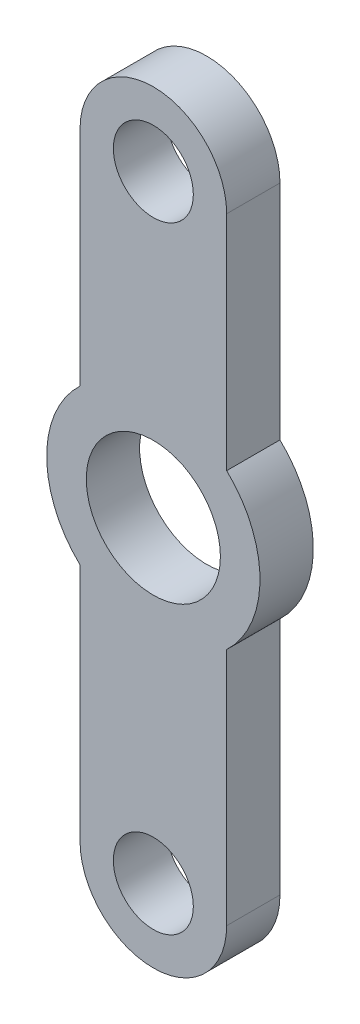
ISO-10303-21;
HEADER;
FILE_DESCRIPTION(('STEP AP214'),'2;1');
FILE_NAME('part.step','',(''),(''),'','','');
FILE_SCHEMA(('AUTOMOTIVE_DESIGN { 1 0 10303 214 1 1 1 1 }'));
ENDSEC;
DATA;
#1=APPLICATION_CONTEXT('core data for automotive mechanical design processes');
#2=APPLICATION_PROTOCOL_DEFINITION('international standard','automotive_design',2000,#1);
#3=PRODUCT_CONTEXT('',#1,'mechanical');
#4=PRODUCT('Part','Part','',(#3));
#5=PRODUCT_RELATED_PRODUCT_CATEGORY('part','',(#4));
#6=PRODUCT_DEFINITION_FORMATION('','',#4);
#7=PRODUCT_DEFINITION_CONTEXT('part definition',#1,'design');
#8=PRODUCT_DEFINITION('design','',#6,#7);
#9=PRODUCT_DEFINITION_SHAPE('','',#8);
#10=(LENGTH_UNIT() NAMED_UNIT(*) SI_UNIT(.MILLI.,.METRE.));
#11=(NAMED_UNIT(*) PLANE_ANGLE_UNIT() SI_UNIT($,.RADIAN.));
#12=(NAMED_UNIT(*) SI_UNIT($,.STERADIAN.) SOLID_ANGLE_UNIT());
#13=UNCERTAINTY_MEASURE_WITH_UNIT(LENGTH_MEASURE(1.E-05),#10,'distance_accuracy_value','');
#14=(GEOMETRIC_REPRESENTATION_CONTEXT(3) GLOBAL_UNCERTAINTY_ASSIGNED_CONTEXT((#13)) GLOBAL_UNIT_ASSIGNED_CONTEXT((#10,
#11,#12)) REPRESENTATION_CONTEXT('',''));
#15=CARTESIAN_POINT('',(0.,0.,0.));
#16=DIRECTION('',(0.,0.,1.));
#17=DIRECTION('',(1.,0.,0.));
#18=AXIS2_PLACEMENT_3D('',#15,#16,#17);
#19=CARTESIAN_POINT('',(0.,22.5,4.));
#20=DIRECTION('',(0.,0.,-1.));
#21=DIRECTION('',(-1.,0.,0.));
#22=AXIS2_PLACEMENT_3D('',#19,#20,#21);
#23=PLANE('',#22);
#24=CARTESIAN_POINT('',(0.,22.5,4.));
#25=DIRECTION('',(0.,0.,1.));
#26=DIRECTION('',(-1.,0.,0.));
#27=AXIS2_PLACEMENT_3D('',#24,#25,#26);
#28=CIRCLE('',#27,5.5);
#29=CARTESIAN_POINT('',(5.5,22.5,4.));
#30=VERTEX_POINT('',#29);
#31=CARTESIAN_POINT('',(-5.5,22.5,4.));
#32=VERTEX_POINT('',#31);
#33=EDGE_CURVE('E164',#30,#32,#28,.T.);
#34=ORIENTED_EDGE('',*,*,#33,.T.);
#35=DIRECTION('',(0.,-1.,0.));
#36=VECTOR('',#35,1.);
#37=CARTESIAN_POINT('',(-5.5,22.5,4.));
#38=LINE('',#37,#36);
#39=CARTESIAN_POINT('',(-5.5,5.80947501931113,4.));
#40=VERTEX_POINT('',#39);
#41=EDGE_CURVE('E100',#32,#40,#38,.T.);
#42=ORIENTED_EDGE('',*,*,#41,.T.);
#43=CARTESIAN_POINT('',(0.,0.,4.));
#44=DIRECTION('',(0.,0.,1.));
#45=DIRECTION('',(-1.,0.,0.));
#46=AXIS2_PLACEMENT_3D('',#43,#44,#45);
#47=CIRCLE('',#46,8.00000000000001);
#48=CARTESIAN_POINT('',(-5.5,-5.80947501931112,4.));
#49=VERTEX_POINT('',#48);
#50=EDGE_CURVE('E185',#40,#49,#47,.T.);
#51=ORIENTED_EDGE('',*,*,#50,.T.);
#52=DIRECTION('',(0.,-1.,0.));
#53=VECTOR('',#52,1.);
#54=CARTESIAN_POINT('',(-5.5,-23.75,4.));
#55=LINE('',#54,#53);
#56=CARTESIAN_POINT('',(-5.5,-23.75,4.));
#57=VERTEX_POINT('',#56);
#58=EDGE_CURVE('E199',#49,#57,#55,.T.);
#59=ORIENTED_EDGE('',*,*,#58,.T.);
#60=CARTESIAN_POINT('',(0.,-23.75,4.));
#61=DIRECTION('',(0.,0.,1.));
#62=DIRECTION('',(1.,0.,0.));
#63=AXIS2_PLACEMENT_3D('',#60,#61,#62);
#64=CIRCLE('',#63,5.5);
#65=CARTESIAN_POINT('',(5.5,-23.75,4.));
#66=VERTEX_POINT('',#65);
#67=EDGE_CURVE('E119',#57,#66,#64,.T.);
#68=ORIENTED_EDGE('',*,*,#67,.T.);
#69=DIRECTION('',(0.,1.,0.));
#70=VECTOR('',#69,1.);
#71=CARTESIAN_POINT('',(5.5,-23.75,4.));
#72=LINE('',#71,#70);
#73=CARTESIAN_POINT('',(5.5,-5.80947501931113,4.));
#74=VERTEX_POINT('',#73);
#75=EDGE_CURVE('E113',#66,#74,#72,.T.);
#76=ORIENTED_EDGE('',*,*,#75,.T.);
#77=CARTESIAN_POINT('',(0.,0.,4.));
#78=DIRECTION('',(0.,0.,1.));
#79=DIRECTION('',(-1.,0.,0.));
#80=AXIS2_PLACEMENT_3D('',#77,#78,#79);
#81=CIRCLE('',#80,8.);
#82=CARTESIAN_POINT('',(5.5,5.80947501931112,4.));
#83=VERTEX_POINT('',#82);
#84=EDGE_CURVE('E117',#74,#83,#81,.T.);
#85=ORIENTED_EDGE('',*,*,#84,.T.);
#86=DIRECTION('',(0.,1.,0.));
#87=VECTOR('',#86,1.);
#88=CARTESIAN_POINT('',(5.5,22.5,4.));
#89=LINE('',#88,#87);
#90=EDGE_CURVE('E57',#83,#30,#89,.T.);
#91=ORIENTED_EDGE('',*,*,#90,.T.);
#92=EDGE_LOOP('',(#34,#42,#51,#59,#68,#76,#85,#91));
#93=FACE_BOUND('',#92,.T.);
#94=CARTESIAN_POINT('',(0.,22.5,4.));
#95=DIRECTION('',(0.,0.,1.));
#96=DIRECTION('',(1.,0.,0.));
#97=AXIS2_PLACEMENT_3D('',#94,#95,#96);
#98=CIRCLE('',#97,3.);
#99=CARTESIAN_POINT('',(3.,22.5,4.));
#100=VERTEX_POINT('',#99);
#101=EDGE_CURVE('E146',#100,#100,#98,.T.);
#102=ORIENTED_EDGE('',*,*,#101,.F.);
#103=EDGE_LOOP('',(#102));
#104=FACE_BOUND('',#103,.T.);
#105=CARTESIAN_POINT('',(0.,-23.75,4.));
#106=DIRECTION('',(0.,0.,1.));
#107=DIRECTION('',(1.,0.,0.));
#108=AXIS2_PLACEMENT_3D('',#105,#106,#107);
#109=CIRCLE('',#108,3.);
#110=CARTESIAN_POINT('',(3.,-23.75,4.));
#111=VERTEX_POINT('',#110);
#112=EDGE_CURVE('E213',#111,#111,#109,.T.);
#113=ORIENTED_EDGE('',*,*,#112,.F.);
#114=EDGE_LOOP('',(#113));
#115=FACE_BOUND('',#114,.T.);
#116=CARTESIAN_POINT('',(0.,0.,4.));
#117=DIRECTION('',(0.,0.,1.));
#118=DIRECTION('',(1.,0.,0.));
#119=AXIS2_PLACEMENT_3D('',#116,#117,#118);
#120=CIRCLE('',#119,5.03);
#121=CARTESIAN_POINT('',(5.03,0.,4.));
#122=VERTEX_POINT('',#121);
#123=EDGE_CURVE('E221',#122,#122,#120,.T.);
#124=ORIENTED_EDGE('',*,*,#123,.F.);
#125=EDGE_LOOP('',(#124));
#126=FACE_BOUND('',#125,.T.);
#127=ADVANCED_FACE('F39',(#93,#104,#115,#126),#23,.F.);
#128=CARTESIAN_POINT('',(0.,22.5,0.));
#129=DIRECTION('',(0.,0.,-1.));
#130=DIRECTION('',(-1.,0.,0.));
#131=AXIS2_PLACEMENT_3D('',#128,#129,#130);
#132=PLANE('',#131);
#133=CARTESIAN_POINT('',(0.,-23.75,0.));
#134=DIRECTION('',(0.,0.,1.));
#135=DIRECTION('',(1.,0.,0.));
#136=AXIS2_PLACEMENT_3D('',#133,#134,#135);
#137=CIRCLE('',#136,3.);
#138=CARTESIAN_POINT('',(3.,-23.75,0.));
#139=VERTEX_POINT('',#138);
#140=EDGE_CURVE('E217',#139,#139,#137,.T.);
#141=ORIENTED_EDGE('',*,*,#140,.T.);
#142=EDGE_LOOP('',(#141));
#143=FACE_BOUND('',#142,.T.);
#144=CARTESIAN_POINT('',(0.,22.5,0.));
#145=DIRECTION('',(0.,0.,1.));
#146=DIRECTION('',(-1.,0.,0.));
#147=AXIS2_PLACEMENT_3D('',#144,#145,#146);
#148=CIRCLE('',#147,5.5);
#149=CARTESIAN_POINT('',(5.5,22.5,0.));
#150=VERTEX_POINT('',#149);
#151=CARTESIAN_POINT('',(-5.5,22.5,0.));
#152=VERTEX_POINT('',#151);
#153=EDGE_CURVE('E141',#150,#152,#148,.T.);
#154=ORIENTED_EDGE('',*,*,#153,.F.);
#155=DIRECTION('',(0.,1.,0.));
#156=VECTOR('',#155,1.);
#157=CARTESIAN_POINT('',(5.5,22.5,0.));
#158=LINE('',#157,#156);
#159=CARTESIAN_POINT('',(5.5,5.80947501931112,0.));
#160=VERTEX_POINT('',#159);
#161=EDGE_CURVE('E92',#160,#150,#158,.T.);
#162=ORIENTED_EDGE('',*,*,#161,.F.);
#163=CARTESIAN_POINT('',(0.,0.,0.));
#164=DIRECTION('',(0.,0.,1.));
#165=DIRECTION('',(-1.,0.,0.));
#166=AXIS2_PLACEMENT_3D('',#163,#164,#165);
#167=CIRCLE('',#166,8.);
#168=CARTESIAN_POINT('',(5.5,-5.80947501931113,0.));
#169=VERTEX_POINT('',#168);
#170=EDGE_CURVE('E86',#169,#160,#167,.T.);
#171=ORIENTED_EDGE('',*,*,#170,.F.);
#172=DIRECTION('',(0.,1.,0.));
#173=VECTOR('',#172,1.);
#174=CARTESIAN_POINT('',(5.5,-23.75,0.));
#175=LINE('',#174,#173);
#176=CARTESIAN_POINT('',(5.5,-23.75,0.));
#177=VERTEX_POINT('',#176);
#178=EDGE_CURVE('E128',#177,#169,#175,.T.);
#179=ORIENTED_EDGE('',*,*,#178,.F.);
#180=CARTESIAN_POINT('',(0.,-23.75,0.));
#181=DIRECTION('',(0.,0.,1.));
#182=DIRECTION('',(1.,0.,0.));
#183=AXIS2_PLACEMENT_3D('',#180,#181,#182);
#184=CIRCLE('',#183,5.5);
#185=CARTESIAN_POINT('',(-5.5,-23.75,0.));
#186=VERTEX_POINT('',#185);
#187=EDGE_CURVE('E155',#186,#177,#184,.T.);
#188=ORIENTED_EDGE('',*,*,#187,.F.);
#189=DIRECTION('',(0.,-1.,0.));
#190=VECTOR('',#189,1.);
#191=CARTESIAN_POINT('',(-5.5,-23.75,0.));
#192=LINE('',#191,#190);
#193=CARTESIAN_POINT('',(-5.5,-5.80947501931112,0.));
#194=VERTEX_POINT('',#193);
#195=EDGE_CURVE('E152',#194,#186,#192,.T.);
#196=ORIENTED_EDGE('',*,*,#195,.F.);
#197=CARTESIAN_POINT('',(0.,0.,0.));
#198=DIRECTION('',(0.,0.,1.));
#199=DIRECTION('',(-1.,0.,0.));
#200=AXIS2_PLACEMENT_3D('',#197,#198,#199);
#201=CIRCLE('',#200,8.00000000000001);
#202=CARTESIAN_POINT('',(-5.5,5.80947501931113,0.));
#203=VERTEX_POINT('',#202);
#204=EDGE_CURVE('E149',#203,#194,#201,.T.);
#205=ORIENTED_EDGE('',*,*,#204,.F.);
#206=DIRECTION('',(0.,-1.,0.));
#207=VECTOR('',#206,1.);
#208=CARTESIAN_POINT('',(-5.5,22.5,0.));
#209=LINE('',#208,#207);
#210=EDGE_CURVE('E145',#152,#203,#209,.T.);
#211=ORIENTED_EDGE('',*,*,#210,.F.);
#212=EDGE_LOOP('',(#154,#162,#171,#179,#188,#196,#205,#211));
#213=FACE_BOUND('',#212,.T.);
#214=CARTESIAN_POINT('',(0.,22.5,0.));
#215=DIRECTION('',(0.,0.,1.));
#216=DIRECTION('',(1.,0.,0.));
#217=AXIS2_PLACEMENT_3D('',#214,#215,#216);
#218=CIRCLE('',#217,3.);
#219=CARTESIAN_POINT('',(3.,22.5,0.));
#220=VERTEX_POINT('',#219);
#221=EDGE_CURVE('E209',#220,#220,#218,.T.);
#222=ORIENTED_EDGE('',*,*,#221,.T.);
#223=EDGE_LOOP('',(#222));
#224=FACE_BOUND('',#223,.T.);
#225=CARTESIAN_POINT('',(0.,0.,0.));
#226=DIRECTION('',(0.,0.,1.));
#227=DIRECTION('',(1.,0.,0.));
#228=AXIS2_PLACEMENT_3D('',#225,#226,#227);
#229=CIRCLE('',#228,5.03);
#230=CARTESIAN_POINT('',(5.03,0.,0.));
#231=VERTEX_POINT('',#230);
#232=EDGE_CURVE('E225',#231,#231,#229,.T.);
#233=ORIENTED_EDGE('',*,*,#232,.T.);
#234=EDGE_LOOP('',(#233));
#235=FACE_BOUND('',#234,.T.);
#236=ADVANCED_FACE('F189',(#143,#213,#224,#235),#132,.T.);
#237=CARTESIAN_POINT('',(0.,22.5,4.));
#238=DIRECTION('',(0.,0.,-1.));
#239=DIRECTION('',(-1.,0.,0.));
#240=AXIS2_PLACEMENT_3D('',#237,#238,#239);
#241=CYLINDRICAL_SURFACE('',#240,5.5);
#242=ORIENTED_EDGE('',*,*,#153,.T.);
#243=DIRECTION('',(0.,0.,-1.));
#244=VECTOR('',#243,1.);
#245=CARTESIAN_POINT('',(-5.5,22.5,4.));
#246=LINE('',#245,#244);
#247=EDGE_CURVE('E11',#32,#152,#246,.T.);
#248=ORIENTED_EDGE('',*,*,#247,.F.);
#249=ORIENTED_EDGE('',*,*,#33,.F.);
#250=DIRECTION('',(0.,0.,-1.));
#251=VECTOR('',#250,1.);
#252=CARTESIAN_POINT('',(5.5,22.5,4.));
#253=LINE('',#252,#251);
#254=EDGE_CURVE('E137',#30,#150,#253,.T.);
#255=ORIENTED_EDGE('',*,*,#254,.T.);
#256=EDGE_LOOP('',(#242,#248,#249,#255));
#257=FACE_BOUND('',#256,.T.);
#258=ADVANCED_FACE('F41',(#257),#241,.T.);
#259=CARTESIAN_POINT('',(-5.5,22.5,4.));
#260=DIRECTION('',(1.,0.,0.));
#261=DIRECTION('',(0.,0.,-1.));
#262=AXIS2_PLACEMENT_3D('',#259,#260,#261);
#263=PLANE('',#262);
#264=ORIENTED_EDGE('',*,*,#210,.T.);
#265=DIRECTION('',(0.,0.,-1.));
#266=VECTOR('',#265,1.);
#267=CARTESIAN_POINT('',(-5.5,5.80947501931113,4.));
#268=LINE('',#267,#266);
#269=EDGE_CURVE('E49',#40,#203,#268,.T.);
#270=ORIENTED_EDGE('',*,*,#269,.F.);
#271=ORIENTED_EDGE('',*,*,#41,.F.);
#272=ORIENTED_EDGE('',*,*,#247,.T.);
#273=EDGE_LOOP('',(#264,#270,#271,#272));
#274=FACE_BOUND('',#273,.T.);
#275=ADVANCED_FACE('F259',(#274),#263,.F.);
#276=CARTESIAN_POINT('',(0.,0.,4.));
#277=DIRECTION('',(0.,0.,-1.));
#278=DIRECTION('',(-1.,0.,0.));
#279=AXIS2_PLACEMENT_3D('',#276,#277,#278);
#280=CYLINDRICAL_SURFACE('',#279,8.00000000000001);
#281=ORIENTED_EDGE('',*,*,#204,.T.);
#282=DIRECTION('',(0.,0.,-1.));
#283=VECTOR('',#282,1.);
#284=CARTESIAN_POINT('',(-5.5,-5.80947501931112,4.));
#285=LINE('',#284,#283);
#286=EDGE_CURVE('E175',#49,#194,#285,.T.);
#287=ORIENTED_EDGE('',*,*,#286,.F.);
#288=ORIENTED_EDGE('',*,*,#50,.F.);
#289=ORIENTED_EDGE('',*,*,#269,.T.);
#290=EDGE_LOOP('',(#281,#287,#288,#289));
#291=FACE_BOUND('',#290,.T.);
#292=ADVANCED_FACE('F183',(#291),#280,.T.);
#293=CARTESIAN_POINT('',(-5.5,-23.75,4.));
#294=DIRECTION('',(1.,0.,0.));
#295=DIRECTION('',(0.,0.,-1.));
#296=AXIS2_PLACEMENT_3D('',#293,#294,#295);
#297=PLANE('',#296);
#298=ORIENTED_EDGE('',*,*,#195,.T.);
#299=DIRECTION('',(0.,0.,-1.));
#300=VECTOR('',#299,1.);
#301=CARTESIAN_POINT('',(-5.5,-23.75,4.));
#302=LINE('',#301,#300);
#303=EDGE_CURVE('E171',#57,#186,#302,.T.);
#304=ORIENTED_EDGE('',*,*,#303,.F.);
#305=ORIENTED_EDGE('',*,*,#58,.F.);
#306=ORIENTED_EDGE('',*,*,#286,.T.);
#307=EDGE_LOOP('',(#298,#304,#305,#306));
#308=FACE_BOUND('',#307,.T.);
#309=ADVANCED_FACE('F194',(#308),#297,.F.);
#310=CARTESIAN_POINT('',(0.,-23.75,4.));
#311=DIRECTION('',(0.,0.,-1.));
#312=DIRECTION('',(-1.,0.,0.));
#313=AXIS2_PLACEMENT_3D('',#310,#311,#312);
#314=CYLINDRICAL_SURFACE('',#313,5.5);
#315=ORIENTED_EDGE('',*,*,#187,.T.);
#316=DIRECTION('',(0.,0.,-1.));
#317=VECTOR('',#316,1.);
#318=CARTESIAN_POINT('',(5.5,-23.75,4.));
#319=LINE('',#318,#317);
#320=EDGE_CURVE('E130',#66,#177,#319,.T.);
#321=ORIENTED_EDGE('',*,*,#320,.F.);
#322=ORIENTED_EDGE('',*,*,#67,.F.);
#323=ORIENTED_EDGE('',*,*,#303,.T.);
#324=EDGE_LOOP('',(#315,#321,#322,#323));
#325=FACE_BOUND('',#324,.T.);
#326=ADVANCED_FACE('F197',(#325),#314,.T.);
#327=CARTESIAN_POINT('',(5.5,-23.75,4.));
#328=DIRECTION('',(-1.,0.,0.));
#329=DIRECTION('',(0.,0.,1.));
#330=AXIS2_PLACEMENT_3D('',#327,#328,#329);
#331=PLANE('',#330);
#332=ORIENTED_EDGE('',*,*,#178,.T.);
#333=DIRECTION('',(0.,0.,-1.));
#334=VECTOR('',#333,1.);
#335=CARTESIAN_POINT('',(5.5,-5.80947501931113,4.));
#336=LINE('',#335,#334);
#337=EDGE_CURVE('E125',#74,#169,#336,.T.);
#338=ORIENTED_EDGE('',*,*,#337,.F.);
#339=ORIENTED_EDGE('',*,*,#75,.F.);
#340=ORIENTED_EDGE('',*,*,#320,.T.);
#341=EDGE_LOOP('',(#332,#338,#339,#340));
#342=FACE_BOUND('',#341,.T.);
#343=ADVANCED_FACE('F126',(#342),#331,.F.);
#344=CARTESIAN_POINT('',(0.,0.,4.));
#345=DIRECTION('',(0.,0.,-1.));
#346=DIRECTION('',(-1.,0.,0.));
#347=AXIS2_PLACEMENT_3D('',#344,#345,#346);
#348=CYLINDRICAL_SURFACE('',#347,8.);
#349=ORIENTED_EDGE('',*,*,#170,.T.);
#350=DIRECTION('',(0.,0.,-1.));
#351=VECTOR('',#350,1.);
#352=CARTESIAN_POINT('',(5.5,5.80947501931112,4.));
#353=LINE('',#352,#351);
#354=EDGE_CURVE('E131',#83,#160,#353,.T.);
#355=ORIENTED_EDGE('',*,*,#354,.F.);
#356=ORIENTED_EDGE('',*,*,#84,.F.);
#357=ORIENTED_EDGE('',*,*,#337,.T.);
#358=EDGE_LOOP('',(#349,#355,#356,#357));
#359=FACE_BOUND('',#358,.T.);
#360=ADVANCED_FACE('F133',(#359),#348,.T.);
#361=CARTESIAN_POINT('',(5.5,22.5,4.));
#362=DIRECTION('',(-1.,0.,0.));
#363=DIRECTION('',(0.,0.,1.));
#364=AXIS2_PLACEMENT_3D('',#361,#362,#363);
#365=PLANE('',#364);
#366=ORIENTED_EDGE('',*,*,#161,.T.);
#367=ORIENTED_EDGE('',*,*,#254,.F.);
#368=ORIENTED_EDGE('',*,*,#90,.F.);
#369=ORIENTED_EDGE('',*,*,#354,.T.);
#370=EDGE_LOOP('',(#366,#367,#368,#369));
#371=FACE_BOUND('',#370,.T.);
#372=ADVANCED_FACE('F247',(#371),#365,.F.);
#373=CARTESIAN_POINT('',(0.,22.5,4.));
#374=DIRECTION('',(0.,0.,-1.));
#375=DIRECTION('',(-1.,0.,0.));
#376=AXIS2_PLACEMENT_3D('',#373,#374,#375);
#377=CYLINDRICAL_SURFACE('',#376,3.);
#378=ORIENTED_EDGE('',*,*,#101,.T.);
#379=EDGE_LOOP('',(#378));
#380=FACE_BOUND('',#379,.T.);
#381=ORIENTED_EDGE('',*,*,#221,.F.);
#382=EDGE_LOOP('',(#381));
#383=FACE_BOUND('',#382,.T.);
#384=ADVANCED_FACE('F244',(#380,#383),#377,.F.);
#385=CARTESIAN_POINT('',(0.,-23.75,4.));
#386=DIRECTION('',(0.,0.,-1.));
#387=DIRECTION('',(-1.,0.,0.));
#388=AXIS2_PLACEMENT_3D('',#385,#386,#387);
#389=CYLINDRICAL_SURFACE('',#388,3.);
#390=ORIENTED_EDGE('',*,*,#112,.T.);
#391=EDGE_LOOP('',(#390));
#392=FACE_BOUND('',#391,.T.);
#393=ORIENTED_EDGE('',*,*,#140,.F.);
#394=EDGE_LOOP('',(#393));
#395=FACE_BOUND('',#394,.T.);
#396=ADVANCED_FACE('F323',(#392,#395),#389,.F.);
#397=CARTESIAN_POINT('',(0.,0.,4.));
#398=DIRECTION('',(0.,0.,-1.));
#399=DIRECTION('',(-1.,0.,0.));
#400=AXIS2_PLACEMENT_3D('',#397,#398,#399);
#401=CYLINDRICAL_SURFACE('',#400,5.03);
#402=ORIENTED_EDGE('',*,*,#123,.T.);
#403=EDGE_LOOP('',(#402));
#404=FACE_BOUND('',#403,.T.);
#405=ORIENTED_EDGE('',*,*,#232,.F.);
#406=EDGE_LOOP('',(#405));
#407=FACE_BOUND('',#406,.T.);
#408=ADVANCED_FACE('F233',(#404,#407),#401,.F.);
#409=CLOSED_SHELL('',(#127,#236,#258,#275,#292,#309,#326,#343,#360,#372,#384,#396,#408));
#410=MANIFOLD_SOLID_BREP('B2',#409);
#411=ADVANCED_BREP_SHAPE_REPRESENTATION('',(#18,#410),#14);
#412=SHAPE_DEFINITION_REPRESENTATION(#9,#411);
ENDSEC;
END-ISO-10303-21;
